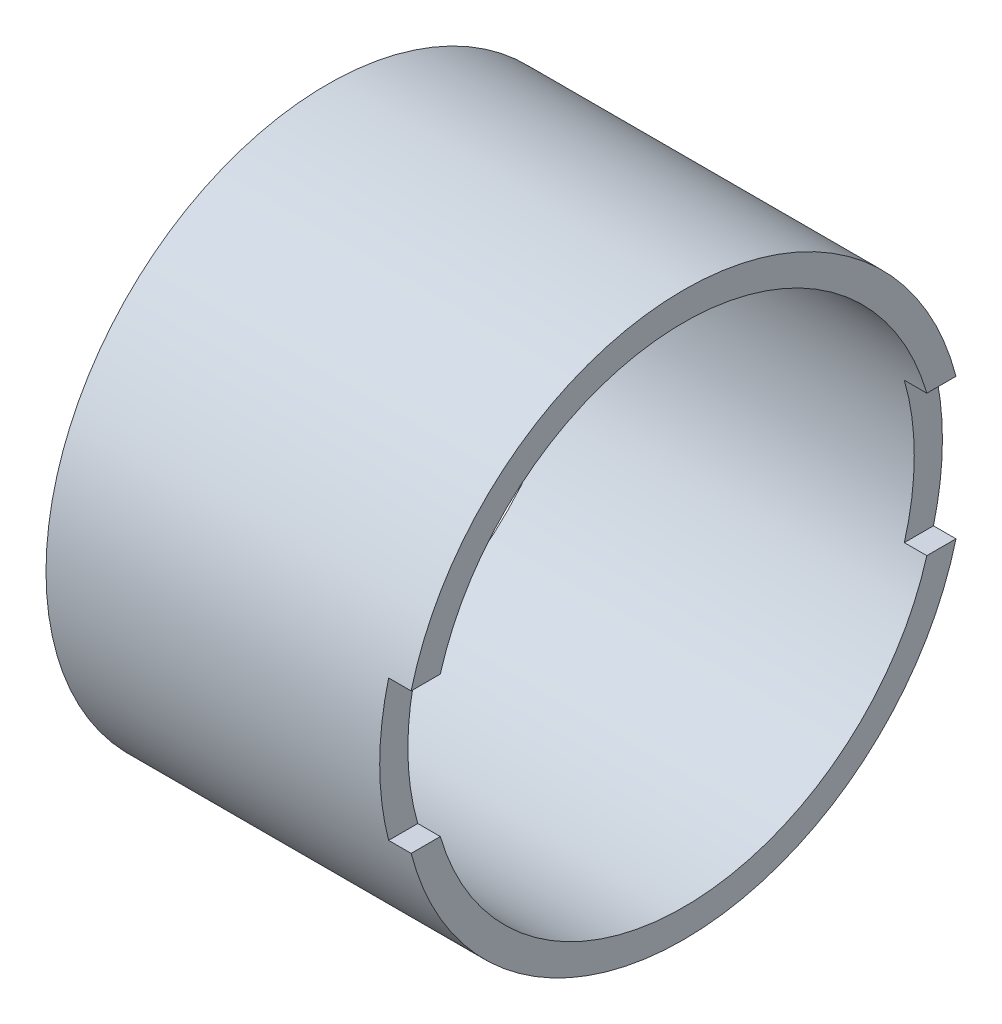
ISO-10303-21;
HEADER;
FILE_DESCRIPTION(('STEP AP214'),'2;1');
FILE_NAME('part.step','',(''),(''),'','','');
FILE_SCHEMA(('AUTOMOTIVE_DESIGN { 1 0 10303 214 1 1 1 1 }'));
ENDSEC;
DATA;
#1=APPLICATION_CONTEXT('core data for automotive mechanical design processes');
#2=APPLICATION_PROTOCOL_DEFINITION('international standard','automotive_design',2000,#1);
#3=PRODUCT_CONTEXT('',#1,'mechanical');
#4=PRODUCT('Part','Part','',(#3));
#5=PRODUCT_RELATED_PRODUCT_CATEGORY('part','',(#4));
#6=PRODUCT_DEFINITION_FORMATION('','',#4);
#7=PRODUCT_DEFINITION_CONTEXT('part definition',#1,'design');
#8=PRODUCT_DEFINITION('design','',#6,#7);
#9=PRODUCT_DEFINITION_SHAPE('','',#8);
#10=(LENGTH_UNIT() NAMED_UNIT(*) SI_UNIT(.MILLI.,.METRE.));
#11=(NAMED_UNIT(*) PLANE_ANGLE_UNIT() SI_UNIT($,.RADIAN.));
#12=(NAMED_UNIT(*) SI_UNIT($,.STERADIAN.) SOLID_ANGLE_UNIT());
#13=UNCERTAINTY_MEASURE_WITH_UNIT(LENGTH_MEASURE(1.E-05),#10,'distance_accuracy_value','');
#14=(GEOMETRIC_REPRESENTATION_CONTEXT(3) GLOBAL_UNCERTAINTY_ASSIGNED_CONTEXT((#13)) GLOBAL_UNIT_ASSIGNED_CONTEXT((#10,
#11,#12)) REPRESENTATION_CONTEXT('',''));
#15=CARTESIAN_POINT('',(0.,0.,0.));
#16=DIRECTION('',(0.,0.,1.));
#17=DIRECTION('',(1.,0.,0.));
#18=AXIS2_PLACEMENT_3D('',#15,#16,#17);
#19=CARTESIAN_POINT('',(34.81,0.,4.75));
#20=DIRECTION('',(1.,0.,0.));
#21=DIRECTION('',(0.,0.,-1.));
#22=AXIS2_PLACEMENT_3D('',#19,#20,#21);
#23=PLANE('',#22);
#24=DIRECTION('',(0.,0.,-1.));
#25=VECTOR('',#24,1.);
#26=CARTESIAN_POINT('',(34.81,1.25,0.));
#27=LINE('',#26,#25);
#28=CARTESIAN_POINT('',(34.81,1.25,4.32290411644765));
#29=VERTEX_POINT('',#28);
#30=CARTESIAN_POINT('',(34.81,1.25,4.84122918275927));
#31=VERTEX_POINT('',#30);
#32=EDGE_CURVE('E115',#29,#31,#27,.F.);
#33=ORIENTED_EDGE('',*,*,#32,.F.);
#34=CARTESIAN_POINT('',(34.81,0.,0.));
#35=DIRECTION('',(-1.,0.,0.));
#36=DIRECTION('',(0.,0.,1.));
#37=AXIS2_PLACEMENT_3D('',#34,#35,#36);
#38=CIRCLE('',#37,4.5);
#39=CARTESIAN_POINT('',(34.81,1.25,-4.32290411644765));
#40=VERTEX_POINT('',#39);
#41=EDGE_CURVE('E19',#29,#40,#38,.T.);
#42=ORIENTED_EDGE('',*,*,#41,.T.);
#43=DIRECTION('',(0.,0.,-1.));
#44=VECTOR('',#43,1.);
#45=CARTESIAN_POINT('',(34.81,1.25,0.));
#46=LINE('',#45,#44);
#47=CARTESIAN_POINT('',(34.81,1.25,-4.84122918275927));
#48=VERTEX_POINT('',#47);
#49=EDGE_CURVE('E95',#48,#40,#46,.F.);
#50=ORIENTED_EDGE('',*,*,#49,.F.);
#51=CARTESIAN_POINT('',(34.81,0.,0.));
#52=DIRECTION('',(-1.,0.,0.));
#53=DIRECTION('',(0.,0.,1.));
#54=AXIS2_PLACEMENT_3D('',#51,#52,#53);
#55=CIRCLE('',#54,5.);
#56=EDGE_CURVE('E110',#31,#48,#55,.T.);
#57=ORIENTED_EDGE('',*,*,#56,.F.);
#58=EDGE_LOOP('',(#33,#42,#50,#57));
#59=FACE_BOUND('',#58,.T.);
#60=ADVANCED_FACE('F16',(#59),#23,.T.);
#61=CARTESIAN_POINT('',(34.61,1.25,0.));
#62=DIRECTION('',(0.,-1.,0.));
#63=DIRECTION('',(0.,0.,-1.));
#64=AXIS2_PLACEMENT_3D('',#61,#62,#63);
#65=PLANE('',#64);
#66=DIRECTION('',(-1.,0.,0.));
#67=VECTOR('',#66,1.);
#68=CARTESIAN_POINT('',(31.645,1.25,-4.84122918275927));
#69=LINE('',#68,#67);
#70=CARTESIAN_POINT('',(34.41,1.25,-4.84122918275927));
#71=VERTEX_POINT('',#70);
#72=EDGE_CURVE('E88',#48,#71,#69,.T.);
#73=ORIENTED_EDGE('',*,*,#72,.F.);
#74=ORIENTED_EDGE('',*,*,#49,.T.);
#75=DIRECTION('',(1.,0.,0.));
#76=VECTOR('',#75,1.);
#77=CARTESIAN_POINT('',(34.61,1.25,-4.32290411644765));
#78=LINE('',#77,#76);
#79=CARTESIAN_POINT('',(34.41,1.25,-4.32290411644765));
#80=VERTEX_POINT('',#79);
#81=EDGE_CURVE('E80',#40,#80,#78,.F.);
#82=ORIENTED_EDGE('',*,*,#81,.T.);
#83=DIRECTION('',(0.,0.,-1.));
#84=VECTOR('',#83,1.);
#85=CARTESIAN_POINT('',(34.41,1.25,0.));
#86=LINE('',#85,#84);
#87=EDGE_CURVE('E87',#71,#80,#86,.F.);
#88=ORIENTED_EDGE('',*,*,#87,.F.);
#89=EDGE_LOOP('',(#73,#74,#82,#88));
#90=FACE_BOUND('',#89,.T.);
#91=ADVANCED_FACE('F94',(#90),#65,.T.);
#92=CARTESIAN_POINT('',(31.645,0.,0.));
#93=DIRECTION('',(-1.,0.,0.));
#94=DIRECTION('',(0.,0.,1.));
#95=AXIS2_PLACEMENT_3D('',#92,#93,#94);
#96=CYLINDRICAL_SURFACE('',#95,4.5);
#97=CARTESIAN_POINT('',(34.41,0.,0.));
#98=DIRECTION('',(-1.,0.,0.));
#99=DIRECTION('',(0.,0.,1.));
#100=AXIS2_PLACEMENT_3D('',#97,#98,#99);
#101=CIRCLE('',#100,4.5);
#102=CARTESIAN_POINT('',(34.41,-1.25,-4.32290411644765));
#103=VERTEX_POINT('',#102);
#104=EDGE_CURVE('E76',#80,#103,#101,.T.);
#105=ORIENTED_EDGE('',*,*,#104,.F.);
#106=ORIENTED_EDGE('',*,*,#81,.F.);
#107=ORIENTED_EDGE('',*,*,#41,.F.);
#108=DIRECTION('',(1.,0.,0.));
#109=VECTOR('',#108,1.);
#110=CARTESIAN_POINT('',(34.61,1.25,4.32290411644765));
#111=LINE('',#110,#109);
#112=CARTESIAN_POINT('',(34.41,1.25,4.32290411644765));
#113=VERTEX_POINT('',#112);
#114=EDGE_CURVE('E112',#113,#29,#111,.T.);
#115=ORIENTED_EDGE('',*,*,#114,.F.);
#116=CARTESIAN_POINT('',(34.41,0.,0.));
#117=DIRECTION('',(-1.,0.,0.));
#118=DIRECTION('',(0.,0.,1.));
#119=AXIS2_PLACEMENT_3D('',#116,#117,#118);
#120=CIRCLE('',#119,4.5);
#121=CARTESIAN_POINT('',(34.41,-1.25,4.32290411644765));
#122=VERTEX_POINT('',#121);
#123=EDGE_CURVE('E116',#122,#113,#120,.T.);
#124=ORIENTED_EDGE('',*,*,#123,.F.);
#125=DIRECTION('',(-1.,0.,0.));
#126=VECTOR('',#125,1.);
#127=CARTESIAN_POINT('',(31.645,-1.25,4.32290411644765));
#128=LINE('',#127,#126);
#129=CARTESIAN_POINT('',(34.81,-1.25,4.32290411644765));
#130=VERTEX_POINT('',#129);
#131=EDGE_CURVE('E117',#130,#122,#128,.T.);
#132=ORIENTED_EDGE('',*,*,#131,.F.);
#133=CARTESIAN_POINT('',(34.81,0.,0.));
#134=DIRECTION('',(-1.,0.,0.));
#135=DIRECTION('',(0.,0.,1.));
#136=AXIS2_PLACEMENT_3D('',#133,#134,#135);
#137=CIRCLE('',#136,4.5);
#138=CARTESIAN_POINT('',(34.81,-1.25,-4.32290411644765));
#139=VERTEX_POINT('',#138);
#140=EDGE_CURVE('E130',#139,#130,#137,.T.);
#141=ORIENTED_EDGE('',*,*,#140,.F.);
#142=DIRECTION('',(1.,0.,0.));
#143=VECTOR('',#142,1.);
#144=CARTESIAN_POINT('',(34.61,-1.25,-4.32290411644765));
#145=LINE('',#144,#143);
#146=EDGE_CURVE('E83',#103,#139,#145,.T.);
#147=ORIENTED_EDGE('',*,*,#146,.F.);
#148=EDGE_LOOP('',(#105,#106,#107,#115,#124,#132,#141,#147));
#149=FACE_BOUND('',#148,.T.);
#150=CARTESIAN_POINT('',(28.48,0.,0.));
#151=DIRECTION('',(-1.,0.,0.));
#152=DIRECTION('',(0.,0.,1.));
#153=AXIS2_PLACEMENT_3D('',#150,#151,#152);
#154=CIRCLE('',#153,4.5);
#155=CARTESIAN_POINT('',(28.48,0.,4.5));
#156=VERTEX_POINT('',#155);
#157=EDGE_CURVE('E111',#156,#156,#154,.F.);
#158=ORIENTED_EDGE('',*,*,#157,.F.);
#159=EDGE_LOOP('',(#158));
#160=FACE_BOUND('',#159,.T.);
#161=ADVANCED_FACE('F78',(#149,#160),#96,.F.);
#162=CARTESIAN_POINT('',(34.61,1.25,0.));
#163=DIRECTION('',(0.,-1.,0.));
#164=DIRECTION('',(0.,0.,-1.));
#165=AXIS2_PLACEMENT_3D('',#162,#163,#164);
#166=PLANE('',#165);
#167=DIRECTION('',(-1.,0.,0.));
#168=VECTOR('',#167,1.);
#169=CARTESIAN_POINT('',(31.645,1.25,4.84122918275927));
#170=LINE('',#169,#168);
#171=CARTESIAN_POINT('',(34.41,1.25,4.84122918275927));
#172=VERTEX_POINT('',#171);
#173=EDGE_CURVE('E107',#172,#31,#170,.F.);
#174=ORIENTED_EDGE('',*,*,#173,.F.);
#175=DIRECTION('',(0.,0.,-1.));
#176=VECTOR('',#175,1.);
#177=CARTESIAN_POINT('',(34.41,1.25,0.));
#178=LINE('',#177,#176);
#179=EDGE_CURVE('E145',#113,#172,#178,.F.);
#180=ORIENTED_EDGE('',*,*,#179,.F.);
#181=ORIENTED_EDGE('',*,*,#114,.T.);
#182=ORIENTED_EDGE('',*,*,#32,.T.);
#183=EDGE_LOOP('',(#174,#180,#181,#182));
#184=FACE_BOUND('',#183,.T.);
#185=ADVANCED_FACE('F149',(#184),#166,.T.);
#186=CARTESIAN_POINT('',(28.48,0.,4.75));
#187=DIRECTION('',(-1.,0.,0.));
#188=DIRECTION('',(0.,0.,1.));
#189=AXIS2_PLACEMENT_3D('',#186,#187,#188);
#190=PLANE('',#189);
#191=ORIENTED_EDGE('',*,*,#157,.T.);
#192=EDGE_LOOP('',(#191));
#193=FACE_BOUND('',#192,.T.);
#194=CARTESIAN_POINT('',(28.48,0.,0.));
#195=DIRECTION('',(-1.,0.,0.));
#196=DIRECTION('',(0.,0.,1.));
#197=AXIS2_PLACEMENT_3D('',#194,#195,#196);
#198=CIRCLE('',#197,5.);
#199=CARTESIAN_POINT('',(28.48,0.,5.));
#200=VERTEX_POINT('',#199);
#201=EDGE_CURVE('E127',#200,#200,#198,.F.);
#202=ORIENTED_EDGE('',*,*,#201,.F.);
#203=EDGE_LOOP('',(#202));
#204=FACE_BOUND('',#203,.T.);
#205=ADVANCED_FACE('F191',(#193,#204),#190,.T.);
#206=CARTESIAN_POINT('',(34.41,0.,0.));
#207=DIRECTION('',(1.,0.,0.));
#208=DIRECTION('',(0.,0.,-1.));
#209=AXIS2_PLACEMENT_3D('',#206,#207,#208);
#210=PLANE('',#209);
#211=ORIENTED_EDGE('',*,*,#87,.T.);
#212=ORIENTED_EDGE('',*,*,#104,.T.);
#213=DIRECTION('',(0.,0.,1.));
#214=VECTOR('',#213,1.);
#215=CARTESIAN_POINT('',(34.41,-1.25,0.));
#216=LINE('',#215,#214);
#217=CARTESIAN_POINT('',(34.41,-1.25,-4.84122918275927));
#218=VERTEX_POINT('',#217);
#219=EDGE_CURVE('E102',#218,#103,#216,.T.);
#220=ORIENTED_EDGE('',*,*,#219,.F.);
#221=CARTESIAN_POINT('',(34.41,0.,0.));
#222=DIRECTION('',(-1.,0.,0.));
#223=DIRECTION('',(0.,0.,1.));
#224=AXIS2_PLACEMENT_3D('',#221,#222,#223);
#225=CIRCLE('',#224,5.);
#226=EDGE_CURVE('E99',#71,#218,#225,.T.);
#227=ORIENTED_EDGE('',*,*,#226,.F.);
#228=EDGE_LOOP('',(#211,#212,#220,#227));
#229=FACE_BOUND('',#228,.T.);
#230=ADVANCED_FACE('F97',(#229),#210,.T.);
#231=CARTESIAN_POINT('',(34.61,-1.25,0.));
#232=DIRECTION('',(0.,1.,0.));
#233=DIRECTION('',(0.,0.,1.));
#234=AXIS2_PLACEMENT_3D('',#231,#232,#233);
#235=PLANE('',#234);
#236=DIRECTION('',(-1.,0.,0.));
#237=VECTOR('',#236,1.);
#238=CARTESIAN_POINT('',(31.645,-1.25,-4.84122918275927));
#239=LINE('',#238,#237);
#240=CARTESIAN_POINT('',(34.81,-1.25,-4.84122918275927));
#241=VERTEX_POINT('',#240);
#242=EDGE_CURVE('E125',#218,#241,#239,.F.);
#243=ORIENTED_EDGE('',*,*,#242,.F.);
#244=ORIENTED_EDGE('',*,*,#219,.T.);
#245=ORIENTED_EDGE('',*,*,#146,.T.);
#246=DIRECTION('',(0.,0.,-1.));
#247=VECTOR('',#246,1.);
#248=CARTESIAN_POINT('',(34.81,-1.25,4.75));
#249=LINE('',#248,#247);
#250=EDGE_CURVE('E133',#241,#139,#249,.F.);
#251=ORIENTED_EDGE('',*,*,#250,.F.);
#252=EDGE_LOOP('',(#243,#244,#245,#251));
#253=FACE_BOUND('',#252,.T.);
#254=ADVANCED_FACE('F164',(#253),#235,.T.);
#255=CARTESIAN_POINT('',(34.81,0.,4.75));
#256=DIRECTION('',(1.,0.,0.));
#257=DIRECTION('',(0.,0.,-1.));
#258=AXIS2_PLACEMENT_3D('',#255,#256,#257);
#259=PLANE('',#258);
#260=DIRECTION('',(0.,0.,1.));
#261=VECTOR('',#260,1.);
#262=CARTESIAN_POINT('',(34.81,-1.25,0.));
#263=LINE('',#262,#261);
#264=CARTESIAN_POINT('',(34.81,-1.25,4.84122918275927));
#265=VERTEX_POINT('',#264);
#266=EDGE_CURVE('E132',#265,#130,#263,.F.);
#267=ORIENTED_EDGE('',*,*,#266,.F.);
#268=CARTESIAN_POINT('',(34.81,0.,0.));
#269=DIRECTION('',(-1.,0.,0.));
#270=DIRECTION('',(0.,0.,1.));
#271=AXIS2_PLACEMENT_3D('',#268,#269,#270);
#272=CIRCLE('',#271,5.);
#273=EDGE_CURVE('E122',#241,#265,#272,.T.);
#274=ORIENTED_EDGE('',*,*,#273,.F.);
#275=ORIENTED_EDGE('',*,*,#250,.T.);
#276=ORIENTED_EDGE('',*,*,#140,.T.);
#277=EDGE_LOOP('',(#267,#274,#275,#276));
#278=FACE_BOUND('',#277,.T.);
#279=ADVANCED_FACE('F166',(#278),#259,.T.);
#280=CARTESIAN_POINT('',(34.61,-1.25,0.));
#281=DIRECTION('',(0.,1.,0.));
#282=DIRECTION('',(0.,0.,1.));
#283=AXIS2_PLACEMENT_3D('',#280,#281,#282);
#284=PLANE('',#283);
#285=DIRECTION('',(-1.,0.,0.));
#286=VECTOR('',#285,1.);
#287=CARTESIAN_POINT('',(31.645,-1.25,4.84122918275927));
#288=LINE('',#287,#286);
#289=CARTESIAN_POINT('',(34.41,-1.25,4.84122918275927));
#290=VERTEX_POINT('',#289);
#291=EDGE_CURVE('E25',#265,#290,#288,.T.);
#292=ORIENTED_EDGE('',*,*,#291,.F.);
#293=ORIENTED_EDGE('',*,*,#266,.T.);
#294=ORIENTED_EDGE('',*,*,#131,.T.);
#295=DIRECTION('',(0.,0.,-1.));
#296=VECTOR('',#295,1.);
#297=CARTESIAN_POINT('',(34.41,-1.25,0.));
#298=LINE('',#297,#296);
#299=EDGE_CURVE('E34',#290,#122,#298,.T.);
#300=ORIENTED_EDGE('',*,*,#299,.F.);
#301=EDGE_LOOP('',(#292,#293,#294,#300));
#302=FACE_BOUND('',#301,.T.);
#303=ADVANCED_FACE('F167',(#302),#284,.T.);
#304=CARTESIAN_POINT('',(34.41,0.,0.));
#305=DIRECTION('',(1.,0.,0.));
#306=DIRECTION('',(0.,0.,-1.));
#307=AXIS2_PLACEMENT_3D('',#304,#305,#306);
#308=PLANE('',#307);
#309=ORIENTED_EDGE('',*,*,#299,.T.);
#310=ORIENTED_EDGE('',*,*,#123,.T.);
#311=ORIENTED_EDGE('',*,*,#179,.T.);
#312=CARTESIAN_POINT('',(34.41,0.,0.));
#313=DIRECTION('',(-1.,0.,0.));
#314=DIRECTION('',(0.,0.,1.));
#315=AXIS2_PLACEMENT_3D('',#312,#313,#314);
#316=CIRCLE('',#315,5.);
#317=EDGE_CURVE('E11',#290,#172,#316,.T.);
#318=ORIENTED_EDGE('',*,*,#317,.F.);
#319=EDGE_LOOP('',(#309,#310,#311,#318));
#320=FACE_BOUND('',#319,.T.);
#321=ADVANCED_FACE('F143',(#320),#308,.T.);
#322=CARTESIAN_POINT('',(31.645,0.,0.));
#323=DIRECTION('',(-1.,0.,0.));
#324=DIRECTION('',(0.,0.,1.));
#325=AXIS2_PLACEMENT_3D('',#322,#323,#324);
#326=CYLINDRICAL_SURFACE('',#325,5.);
#327=ORIENTED_EDGE('',*,*,#201,.T.);
#328=EDGE_LOOP('',(#327));
#329=FACE_BOUND('',#328,.T.);
#330=ORIENTED_EDGE('',*,*,#291,.T.);
#331=ORIENTED_EDGE('',*,*,#317,.T.);
#332=ORIENTED_EDGE('',*,*,#173,.T.);
#333=ORIENTED_EDGE('',*,*,#56,.T.);
#334=ORIENTED_EDGE('',*,*,#72,.T.);
#335=ORIENTED_EDGE('',*,*,#226,.T.);
#336=ORIENTED_EDGE('',*,*,#242,.T.);
#337=ORIENTED_EDGE('',*,*,#273,.T.);
#338=EDGE_LOOP('',(#330,#331,#332,#333,#334,#335,#336,#337));
#339=FACE_BOUND('',#338,.T.);
#340=ADVANCED_FACE('F161',(#329,#339),#326,.T.);
#341=CLOSED_SHELL('',(#60,#91,#161,#185,#205,#230,#254,#279,#303,#321,#340));
#342=MANIFOLD_SOLID_BREP('B1',#341);
#343=ADVANCED_BREP_SHAPE_REPRESENTATION('',(#18,#342),#14);
#344=SHAPE_DEFINITION_REPRESENTATION(#9,#343);
ENDSEC;
END-ISO-10303-21;
